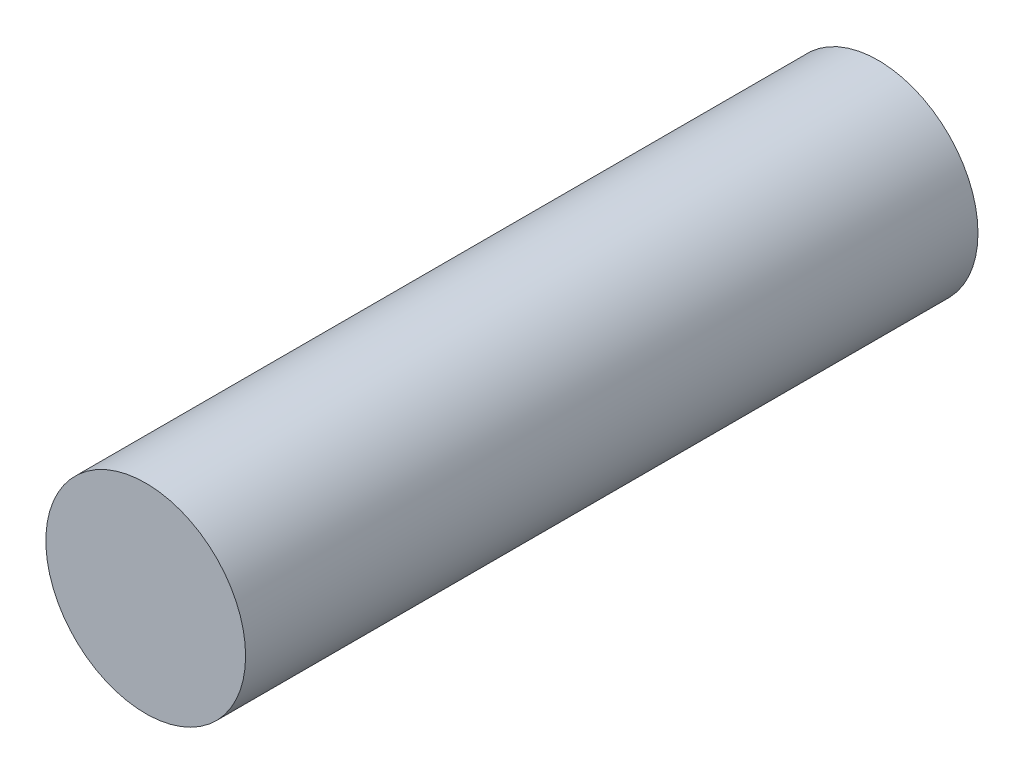
ISO-10303-21;
HEADER;
FILE_DESCRIPTION(('STEP AP214'),'2;1');
FILE_NAME('part.step','',(''),(''),'','','');
FILE_SCHEMA(('AUTOMOTIVE_DESIGN { 1 0 10303 214 1 1 1 1 }'));
ENDSEC;
DATA;
#1=APPLICATION_CONTEXT('core data for automotive mechanical design processes');
#2=APPLICATION_PROTOCOL_DEFINITION('international standard','automotive_design',2000,#1);
#3=PRODUCT_CONTEXT('',#1,'mechanical');
#4=PRODUCT('Part','Part','',(#3));
#5=PRODUCT_RELATED_PRODUCT_CATEGORY('part','',(#4));
#6=PRODUCT_DEFINITION_FORMATION('','',#4);
#7=PRODUCT_DEFINITION_CONTEXT('part definition',#1,'design');
#8=PRODUCT_DEFINITION('design','',#6,#7);
#9=PRODUCT_DEFINITION_SHAPE('','',#8);
#10=(LENGTH_UNIT() NAMED_UNIT(*) SI_UNIT(.MILLI.,.METRE.));
#11=(NAMED_UNIT(*) PLANE_ANGLE_UNIT() SI_UNIT($,.RADIAN.));
#12=(NAMED_UNIT(*) SI_UNIT($,.STERADIAN.) SOLID_ANGLE_UNIT());
#13=UNCERTAINTY_MEASURE_WITH_UNIT(LENGTH_MEASURE(1.E-05),#10,'distance_accuracy_value','');
#14=(GEOMETRIC_REPRESENTATION_CONTEXT(3) GLOBAL_UNCERTAINTY_ASSIGNED_CONTEXT((#13)) GLOBAL_UNIT_ASSIGNED_CONTEXT((#10,
#11,#12)) REPRESENTATION_CONTEXT('',''));
#15=CARTESIAN_POINT('',(0.,0.,0.));
#16=DIRECTION('',(0.,0.,1.));
#17=DIRECTION('',(1.,0.,0.));
#18=AXIS2_PLACEMENT_3D('',#15,#16,#17);
#19=CARTESIAN_POINT('',(0.,0.,66.));
#20=DIRECTION('',(0.,0.,-1.));
#21=DIRECTION('',(-1.,0.,0.));
#22=AXIS2_PLACEMENT_3D('',#19,#20,#21);
#23=CYLINDRICAL_SURFACE('',#22,9.);
#24=CARTESIAN_POINT('',(0.,0.,66.));
#25=DIRECTION('',(0.,0.,1.));
#26=DIRECTION('',(1.,0.,0.));
#27=AXIS2_PLACEMENT_3D('',#24,#25,#26);
#28=CIRCLE('',#27,9.);
#29=CARTESIAN_POINT('',(9.,0.,66.));
#30=VERTEX_POINT('',#29);
#31=EDGE_CURVE('E10',#30,#30,#28,.T.);
#32=ORIENTED_EDGE('',*,*,#31,.F.);
#33=EDGE_LOOP('',(#32));
#34=FACE_BOUND('',#33,.T.);
#35=CARTESIAN_POINT('',(0.,0.,0.));
#36=DIRECTION('',(0.,0.,1.));
#37=DIRECTION('',(1.,0.,0.));
#38=AXIS2_PLACEMENT_3D('',#35,#36,#37);
#39=CIRCLE('',#38,9.);
#40=CARTESIAN_POINT('',(9.,0.,0.));
#41=VERTEX_POINT('',#40);
#42=EDGE_CURVE('E34',#41,#41,#39,.T.);
#43=ORIENTED_EDGE('',*,*,#42,.T.);
#44=EDGE_LOOP('',(#43));
#45=FACE_BOUND('',#44,.T.);
#46=ADVANCED_FACE('F31',(#34,#45),#23,.T.);
#47=CARTESIAN_POINT('',(0.,0.,66.));
#48=DIRECTION('',(0.,0.,1.));
#49=DIRECTION('',(1.,0.,0.));
#50=AXIS2_PLACEMENT_3D('',#47,#48,#49);
#51=PLANE('',#50);
#52=ORIENTED_EDGE('',*,*,#31,.T.);
#53=EDGE_LOOP('',(#52));
#54=FACE_BOUND('',#53,.T.);
#55=ADVANCED_FACE('F46',(#54),#51,.T.);
#56=CARTESIAN_POINT('',(0.,0.,0.));
#57=DIRECTION('',(0.,0.,1.));
#58=DIRECTION('',(1.,0.,0.));
#59=AXIS2_PLACEMENT_3D('',#56,#57,#58);
#60=PLANE('',#59);
#61=ORIENTED_EDGE('',*,*,#42,.F.);
#62=EDGE_LOOP('',(#61));
#63=FACE_BOUND('',#62,.T.);
#64=ADVANCED_FACE('F44',(#63),#60,.F.);
#65=CLOSED_SHELL('',(#46,#55,#64));
#66=MANIFOLD_SOLID_BREP('B2',#65);
#67=ADVANCED_BREP_SHAPE_REPRESENTATION('',(#18,#66),#14);
#68=SHAPE_DEFINITION_REPRESENTATION(#9,#67);
ENDSEC;
END-ISO-10303-21;
